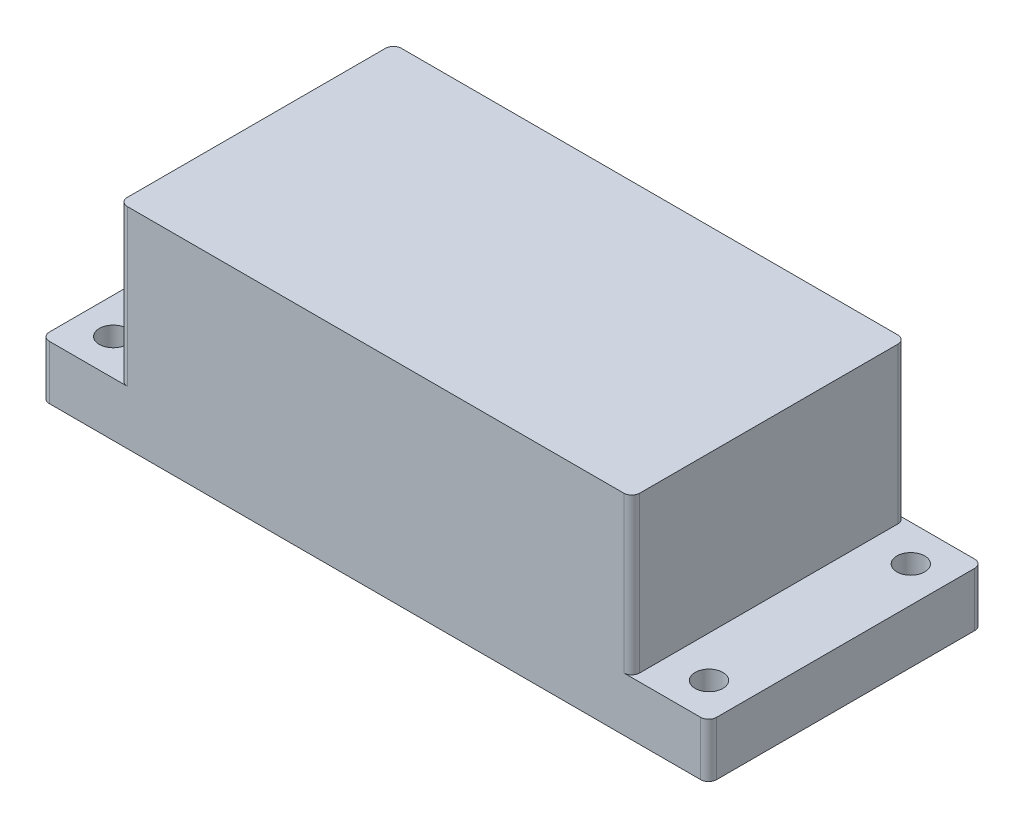
ISO-10303-21;
HEADER;
FILE_DESCRIPTION(('STEP AP214'),'2;1');
FILE_NAME('part.step','',(''),(''),'','','');
FILE_SCHEMA(('AUTOMOTIVE_DESIGN { 1 0 10303 214 1 1 1 1 }'));
ENDSEC;
DATA;
#1=APPLICATION_CONTEXT('core data for automotive mechanical design processes');
#2=APPLICATION_PROTOCOL_DEFINITION('international standard','automotive_design',2000,#1);
#3=PRODUCT_CONTEXT('',#1,'mechanical');
#4=PRODUCT('Part','Part','',(#3));
#5=PRODUCT_RELATED_PRODUCT_CATEGORY('part','',(#4));
#6=PRODUCT_DEFINITION_FORMATION('','',#4);
#7=PRODUCT_DEFINITION_CONTEXT('part definition',#1,'design');
#8=PRODUCT_DEFINITION('design','',#6,#7);
#9=PRODUCT_DEFINITION_SHAPE('','',#8);
#10=(LENGTH_UNIT() NAMED_UNIT(*) SI_UNIT(.MILLI.,.METRE.));
#11=(NAMED_UNIT(*) PLANE_ANGLE_UNIT() SI_UNIT($,.RADIAN.));
#12=(NAMED_UNIT(*) SI_UNIT($,.STERADIAN.) SOLID_ANGLE_UNIT());
#13=UNCERTAINTY_MEASURE_WITH_UNIT(LENGTH_MEASURE(1.E-05),#10,'distance_accuracy_value','');
#14=(GEOMETRIC_REPRESENTATION_CONTEXT(3) GLOBAL_UNCERTAINTY_ASSIGNED_CONTEXT((#13)) GLOBAL_UNIT_ASSIGNED_CONTEXT((#10,
#11,#12)) REPRESENTATION_CONTEXT('',''));
#15=CARTESIAN_POINT('',(0.,0.,0.));
#16=DIRECTION('',(0.,0.,1.));
#17=DIRECTION('',(1.,0.,0.));
#18=AXIS2_PLACEMENT_3D('',#15,#16,#17);
#19=CARTESIAN_POINT('',(0.,6.8,0.));
#20=DIRECTION('',(0.,1.,0.));
#21=DIRECTION('',(0.,0.,1.));
#22=AXIS2_PLACEMENT_3D('',#19,#20,#21);
#23=PLANE('',#22);
#24=CARTESIAN_POINT('',(-11.751256281407,6.8,-4.20125628140704));
#25=DIRECTION('',(0.,1.,0.));
#26=DIRECTION('',(0.,0.,1.));
#27=AXIS2_PLACEMENT_3D('',#24,#25,#26);
#28=CIRCLE('',#27,1.75);
#29=CARTESIAN_POINT('',(-11.751256281407,6.8,-2.45125628140704));
#30=VERTEX_POINT('',#29);
#31=EDGE_CURVE('E537',#30,#30,#28,.T.);
#32=ORIENTED_EDGE('',*,*,#31,.F.);
#33=EDGE_LOOP('',(#32));
#34=FACE_BOUND('',#33,.T.);
#35=CARTESIAN_POINT('',(-11.751256281407,6.8,21.198743718593));
#36=DIRECTION('',(0.,1.,0.));
#37=DIRECTION('',(0.,0.,1.));
#38=AXIS2_PLACEMENT_3D('',#35,#36,#37);
#39=CIRCLE('',#38,1.75);
#40=CARTESIAN_POINT('',(-11.751256281407,6.8,22.948743718593));
#41=VERTEX_POINT('',#40);
#42=EDGE_CURVE('E533',#41,#41,#39,.T.);
#43=ORIENTED_EDGE('',*,*,#42,.F.);
#44=EDGE_LOOP('',(#43));
#45=FACE_BOUND('',#44,.T.);
#46=DIRECTION('',(-1.,0.,0.));
#47=VECTOR('',#46,1.);
#48=CARTESIAN_POINT('',(-16.251256281407,6.8,-8.75125628140704));
#49=LINE('',#48,#47);
#50=CARTESIAN_POINT('',(-5.42534079512154,6.8,-8.75125628140704));
#51=VERTEX_POINT('',#50);
#52=CARTESIAN_POINT('',(-15.251256281407,6.8,-8.75125628140704));
#53=VERTEX_POINT('',#52);
#54=EDGE_CURVE('E240',#51,#53,#49,.T.);
#55=ORIENTED_EDGE('',*,*,#54,.T.);
#56=CARTESIAN_POINT('',(-15.251256281407,6.8,-7.75125628140704));
#57=DIRECTION('',(0.,1.,0.));
#58=DIRECTION('',(0.,0.,1.));
#59=AXIS2_PLACEMENT_3D('',#56,#57,#58);
#60=CIRCLE('',#59,1.);
#61=CARTESIAN_POINT('',(-16.251256281407,6.8,-7.75125628140704));
#62=VERTEX_POINT('',#61);
#63=EDGE_CURVE('E207',#53,#62,#60,.T.);
#64=ORIENTED_EDGE('',*,*,#63,.T.);
#65=DIRECTION('',(0.,0.,1.));
#66=VECTOR('',#65,1.);
#67=CARTESIAN_POINT('',(-16.251256281407,6.8,-8.75125628140704));
#68=LINE('',#67,#66);
#69=CARTESIAN_POINT('',(-16.251256281407,6.8,24.748743718593));
#70=VERTEX_POINT('',#69);
#71=EDGE_CURVE('E174',#62,#70,#68,.T.);
#72=ORIENTED_EDGE('',*,*,#71,.T.);
#73=CARTESIAN_POINT('',(-15.251256281407,6.8,24.748743718593));
#74=DIRECTION('',(0.,1.,0.));
#75=DIRECTION('',(0.,0.,1.));
#76=AXIS2_PLACEMENT_3D('',#73,#74,#75);
#77=CIRCLE('',#76,1.);
#78=CARTESIAN_POINT('',(-15.251256281407,6.8,25.748743718593));
#79=VERTEX_POINT('',#78);
#80=EDGE_CURVE('E205',#70,#79,#77,.T.);
#81=ORIENTED_EDGE('',*,*,#80,.T.);
#82=DIRECTION('',(1.,0.,0.));
#83=VECTOR('',#82,1.);
#84=CARTESIAN_POINT('',(-16.251256281407,6.8,25.748743718593));
#85=LINE('',#84,#83);
#86=CARTESIAN_POINT('',(-5.42534079512154,6.8,25.748743718593));
#87=VERTEX_POINT('',#86);
#88=EDGE_CURVE('E270',#79,#87,#85,.T.);
#89=ORIENTED_EDGE('',*,*,#88,.T.);
#90=CARTESIAN_POINT('',(-5.42534079512154,6.8,24.748743718593));
#91=DIRECTION('',(0.,1.,0.));
#92=DIRECTION('',(0.,0.,1.));
#93=AXIS2_PLACEMENT_3D('',#90,#91,#92);
#94=CIRCLE('',#93,1.);
#95=CARTESIAN_POINT('',(-6.42534079512154,6.8,24.748743718593));
#96=VERTEX_POINT('',#95);
#97=EDGE_CURVE('E11',#87,#96,#94,.F.);
#98=ORIENTED_EDGE('',*,*,#97,.T.);
#99=DIRECTION('',(0.,0.,1.));
#100=VECTOR('',#99,1.);
#101=CARTESIAN_POINT('',(-6.42534079512154,6.8,-8.75125628140704));
#102=LINE('',#101,#100);
#103=CARTESIAN_POINT('',(-6.42534079512154,6.8,-7.75125628140704));
#104=VERTEX_POINT('',#103);
#105=EDGE_CURVE('E242',#104,#96,#102,.T.);
#106=ORIENTED_EDGE('',*,*,#105,.F.);
#107=CARTESIAN_POINT('',(-5.42534079512154,6.8,-7.75125628140704));
#108=DIRECTION('',(0.,1.,0.));
#109=DIRECTION('',(0.,0.,1.));
#110=AXIS2_PLACEMENT_3D('',#107,#108,#109);
#111=CIRCLE('',#110,1.);
#112=EDGE_CURVE('E41',#104,#51,#111,.F.);
#113=ORIENTED_EDGE('',*,*,#112,.T.);
#114=EDGE_LOOP('',(#55,#64,#72,#81,#89,#98,#106,#113));
#115=FACE_BOUND('',#114,.T.);
#116=ADVANCED_FACE('F33',(#34,#45,#115),#23,.T.);
#117=CARTESIAN_POINT('',(-16.251256281407,6.8,-8.75125628140704));
#118=DIRECTION('',(1.,0.,0.));
#119=DIRECTION('',(0.,0.,-1.));
#120=AXIS2_PLACEMENT_3D('',#117,#118,#119);
#121=PLANE('',#120);
#122=ORIENTED_EDGE('',*,*,#71,.F.);
#123=DIRECTION('',(0.,-1.,0.));
#124=VECTOR('',#123,1.);
#125=CARTESIAN_POINT('',(-16.251256281407,6.8,-7.75125628140704));
#126=LINE('',#125,#124);
#127=CARTESIAN_POINT('',(-16.251256281407,0.,-7.75125628140704));
#128=VERTEX_POINT('',#127);
#129=EDGE_CURVE('E202',#62,#128,#126,.T.);
#130=ORIENTED_EDGE('',*,*,#129,.T.);
#131=DIRECTION('',(0.,0.,1.));
#132=VECTOR('',#131,1.);
#133=CARTESIAN_POINT('',(-16.251256281407,0.,-8.75125628140704));
#134=LINE('',#133,#132);
#135=CARTESIAN_POINT('',(-16.251256281407,0.,24.748743718593));
#136=VERTEX_POINT('',#135);
#137=EDGE_CURVE('E255',#128,#136,#134,.T.);
#138=ORIENTED_EDGE('',*,*,#137,.T.);
#139=DIRECTION('',(0.,-1.,0.));
#140=VECTOR('',#139,1.);
#141=CARTESIAN_POINT('',(-16.251256281407,6.8,24.748743718593));
#142=LINE('',#141,#140);
#143=EDGE_CURVE('E200',#136,#70,#142,.F.);
#144=ORIENTED_EDGE('',*,*,#143,.T.);
#145=EDGE_LOOP('',(#122,#130,#138,#144));
#146=FACE_BOUND('',#145,.T.);
#147=ADVANCED_FACE('F299',(#146),#121,.F.);
#148=CARTESIAN_POINT('',(-16.251256281407,6.8,25.748743718593));
#149=DIRECTION('',(0.,0.,-1.));
#150=DIRECTION('',(-1.,0.,0.));
#151=AXIS2_PLACEMENT_3D('',#148,#149,#150);
#152=PLANE('',#151);
#153=CARTESIAN_POINT('',(57.0746592048785,6.8,25.748743718593));
#154=VERTEX_POINT('',#153);
#155=CARTESIAN_POINT('',(66.7487437185929,6.8,25.748743718593));
#156=VERTEX_POINT('',#155);
#157=EDGE_CURVE('E178',#154,#156,#85,.T.);
#158=ORIENTED_EDGE('',*,*,#157,.F.);
#159=DIRECTION('',(0.,-1.,0.));
#160=VECTOR('',#159,1.);
#161=CARTESIAN_POINT('',(57.0746592048785,6.8,25.748743718593));
#162=LINE('',#161,#160);
#163=CARTESIAN_POINT('',(57.0746592048785,26.4,25.748743718593));
#164=VERTEX_POINT('',#163);
#165=EDGE_CURVE('E217',#154,#164,#162,.F.);
#166=ORIENTED_EDGE('',*,*,#165,.T.);
#167=DIRECTION('',(1.,0.,0.));
#168=VECTOR('',#167,1.);
#169=CARTESIAN_POINT('',(-6.42534079512154,26.4,25.748743718593));
#170=LINE('',#169,#168);
#171=CARTESIAN_POINT('',(-5.42534079512154,26.4,25.748743718593));
#172=VERTEX_POINT('',#171);
#173=EDGE_CURVE('E260',#172,#164,#170,.T.);
#174=ORIENTED_EDGE('',*,*,#173,.F.);
#175=DIRECTION('',(0.,-1.,0.));
#176=VECTOR('',#175,1.);
#177=CARTESIAN_POINT('',(-5.42534079512154,6.8,25.748743718593));
#178=LINE('',#177,#176);
#179=EDGE_CURVE('E214',#172,#87,#178,.T.);
#180=ORIENTED_EDGE('',*,*,#179,.T.);
#181=ORIENTED_EDGE('',*,*,#88,.F.);
#182=DIRECTION('',(0.,-1.,0.));
#183=VECTOR('',#182,1.);
#184=CARTESIAN_POINT('',(-15.251256281407,6.8,25.748743718593));
#185=LINE('',#184,#183);
#186=CARTESIAN_POINT('',(-15.251256281407,0.,25.748743718593));
#187=VERTEX_POINT('',#186);
#188=EDGE_CURVE('E195',#79,#187,#185,.T.);
#189=ORIENTED_EDGE('',*,*,#188,.T.);
#190=DIRECTION('',(1.,0.,0.));
#191=VECTOR('',#190,1.);
#192=CARTESIAN_POINT('',(-16.251256281407,0.,25.748743718593));
#193=LINE('',#192,#191);
#194=CARTESIAN_POINT('',(66.7487437185929,0.,25.748743718593));
#195=VERTEX_POINT('',#194);
#196=EDGE_CURVE('E180',#187,#195,#193,.T.);
#197=ORIENTED_EDGE('',*,*,#196,.T.);
#198=DIRECTION('',(0.,-1.,0.));
#199=VECTOR('',#198,1.);
#200=CARTESIAN_POINT('',(66.748743718593,6.8,25.748743718593));
#201=LINE('',#200,#199);
#202=EDGE_CURVE('E198',#195,#156,#201,.F.);
#203=ORIENTED_EDGE('',*,*,#202,.T.);
#204=EDGE_LOOP('',(#158,#166,#174,#180,#181,#189,#197,#203));
#205=FACE_BOUND('',#204,.T.);
#206=ADVANCED_FACE('F279',(#205),#152,.F.);
#207=CARTESIAN_POINT('',(67.748743718593,6.8,-8.75125628140704));
#208=DIRECTION('',(-1.,0.,0.));
#209=DIRECTION('',(0.,0.,1.));
#210=AXIS2_PLACEMENT_3D('',#207,#208,#209);
#211=PLANE('',#210);
#212=DIRECTION('',(0.,0.,-1.));
#213=VECTOR('',#212,1.);
#214=CARTESIAN_POINT('',(67.748743718593,0.,-8.75125628140704));
#215=LINE('',#214,#213);
#216=CARTESIAN_POINT('',(67.748743718593,0.,24.748743718593));
#217=VERTEX_POINT('',#216);
#218=CARTESIAN_POINT('',(67.748743718593,0.,-7.75125628140704));
#219=VERTEX_POINT('',#218);
#220=EDGE_CURVE('E175',#217,#219,#215,.T.);
#221=ORIENTED_EDGE('',*,*,#220,.T.);
#222=DIRECTION('',(0.,-1.,0.));
#223=VECTOR('',#222,1.);
#224=CARTESIAN_POINT('',(67.748743718593,6.8,-7.75125628140704));
#225=LINE('',#224,#223);
#226=CARTESIAN_POINT('',(67.748743718593,6.8,-7.75125628140704));
#227=VERTEX_POINT('',#226);
#228=EDGE_CURVE('E151',#219,#227,#225,.F.);
#229=ORIENTED_EDGE('',*,*,#228,.T.);
#230=DIRECTION('',(0.,0.,-1.));
#231=VECTOR('',#230,1.);
#232=CARTESIAN_POINT('',(67.748743718593,6.8,-8.75125628140704));
#233=LINE('',#232,#231);
#234=CARTESIAN_POINT('',(67.748743718593,6.8,24.748743718593));
#235=VERTEX_POINT('',#234);
#236=EDGE_CURVE('E272',#235,#227,#233,.T.);
#237=ORIENTED_EDGE('',*,*,#236,.F.);
#238=DIRECTION('',(0.,-1.,0.));
#239=VECTOR('',#238,1.);
#240=CARTESIAN_POINT('',(67.748743718593,6.8,24.748743718593));
#241=LINE('',#240,#239);
#242=EDGE_CURVE('E156',#235,#217,#241,.T.);
#243=ORIENTED_EDGE('',*,*,#242,.T.);
#244=EDGE_LOOP('',(#221,#229,#237,#243));
#245=FACE_BOUND('',#244,.T.);
#246=ADVANCED_FACE('F291',(#245),#211,.F.);
#247=CARTESIAN_POINT('',(-16.251256281407,6.8,-8.75125628140704));
#248=DIRECTION('',(0.,0.,1.));
#249=DIRECTION('',(1.,0.,0.));
#250=AXIS2_PLACEMENT_3D('',#247,#248,#249);
#251=PLANE('',#250);
#252=DIRECTION('',(-1.,0.,0.));
#253=VECTOR('',#252,1.);
#254=CARTESIAN_POINT('',(-6.42534079512154,26.4,-8.75125628140704));
#255=LINE('',#254,#253);
#256=CARTESIAN_POINT('',(57.0746592048785,26.4,-8.75125628140704));
#257=VERTEX_POINT('',#256);
#258=CARTESIAN_POINT('',(-5.42534079512154,26.4,-8.75125628140704));
#259=VERTEX_POINT('',#258);
#260=EDGE_CURVE('E246',#257,#259,#255,.T.);
#261=ORIENTED_EDGE('',*,*,#260,.F.);
#262=DIRECTION('',(0.,-1.,0.));
#263=VECTOR('',#262,1.);
#264=CARTESIAN_POINT('',(57.0746592048785,6.8,-8.75125628140704));
#265=LINE('',#264,#263);
#266=CARTESIAN_POINT('',(57.0746592048784,6.8,-8.75125628140704));
#267=VERTEX_POINT('',#266);
#268=EDGE_CURVE('E229',#257,#267,#265,.T.);
#269=ORIENTED_EDGE('',*,*,#268,.T.);
#270=CARTESIAN_POINT('',(66.7487437185929,6.8,-8.75125628140704));
#271=VERTEX_POINT('',#270);
#272=EDGE_CURVE('E167',#271,#267,#49,.T.);
#273=ORIENTED_EDGE('',*,*,#272,.F.);
#274=DIRECTION('',(0.,-1.,0.));
#275=VECTOR('',#274,1.);
#276=CARTESIAN_POINT('',(66.748743718593,6.8,-8.75125628140704));
#277=LINE('',#276,#275);
#278=CARTESIAN_POINT('',(66.7487437185929,0.,-8.75125628140704));
#279=VERTEX_POINT('',#278);
#280=EDGE_CURVE('E150',#271,#279,#277,.T.);
#281=ORIENTED_EDGE('',*,*,#280,.T.);
#282=DIRECTION('',(-1.,0.,0.));
#283=VECTOR('',#282,1.);
#284=CARTESIAN_POINT('',(-16.251256281407,0.,-8.75125628140704));
#285=LINE('',#284,#283);
#286=CARTESIAN_POINT('',(-15.251256281407,0.,-8.75125628140704));
#287=VERTEX_POINT('',#286);
#288=EDGE_CURVE('E164',#279,#287,#285,.T.);
#289=ORIENTED_EDGE('',*,*,#288,.T.);
#290=DIRECTION('',(0.,-1.,0.));
#291=VECTOR('',#290,1.);
#292=CARTESIAN_POINT('',(-15.251256281407,6.8,-8.75125628140704));
#293=LINE('',#292,#291);
#294=EDGE_CURVE('E169',#287,#53,#293,.F.);
#295=ORIENTED_EDGE('',*,*,#294,.T.);
#296=ORIENTED_EDGE('',*,*,#54,.F.);
#297=DIRECTION('',(0.,-1.,0.));
#298=VECTOR('',#297,1.);
#299=CARTESIAN_POINT('',(-5.42534079512154,6.8,-8.75125628140704));
#300=LINE('',#299,#298);
#301=EDGE_CURVE('E227',#51,#259,#300,.F.);
#302=ORIENTED_EDGE('',*,*,#301,.T.);
#303=EDGE_LOOP('',(#261,#269,#273,#281,#289,#295,#296,#302));
#304=FACE_BOUND('',#303,.T.);
#305=ADVANCED_FACE('F163',(#304),#251,.F.);
#306=CARTESIAN_POINT('',(63.248743718593,6.8,21.198743718593));
#307=DIRECTION('',(0.,1.,0.));
#308=DIRECTION('',(0.,0.,1.));
#309=AXIS2_PLACEMENT_3D('',#306,#307,#308);
#310=CIRCLE('',#309,1.75);
#311=CARTESIAN_POINT('',(63.248743718593,6.8,22.948743718593));
#312=VERTEX_POINT('',#311);
#313=EDGE_CURVE('E323',#312,#312,#310,.T.);
#314=ORIENTED_EDGE('',*,*,#313,.F.);
#315=EDGE_LOOP('',(#314));
#316=FACE_BOUND('',#315,.T.);
#317=CARTESIAN_POINT('',(63.248743718593,6.8,-4.20125628140704));
#318=DIRECTION('',(0.,1.,0.));
#319=DIRECTION('',(0.,0.,1.));
#320=AXIS2_PLACEMENT_3D('',#317,#318,#319);
#321=CIRCLE('',#320,1.75);
#322=CARTESIAN_POINT('',(63.248743718593,6.8,-2.45125628140704));
#323=VERTEX_POINT('',#322);
#324=EDGE_CURVE('E326',#323,#323,#321,.T.);
#325=ORIENTED_EDGE('',*,*,#324,.F.);
#326=EDGE_LOOP('',(#325));
#327=FACE_BOUND('',#326,.T.);
#328=ORIENTED_EDGE('',*,*,#236,.T.);
#329=CARTESIAN_POINT('',(66.748743718593,6.8,-7.75125628140704));
#330=DIRECTION('',(0.,1.,0.));
#331=DIRECTION('',(0.,0.,1.));
#332=AXIS2_PLACEMENT_3D('',#329,#330,#331);
#333=CIRCLE('',#332,1.);
#334=EDGE_CURVE('E193',#227,#271,#333,.T.);
#335=ORIENTED_EDGE('',*,*,#334,.T.);
#336=ORIENTED_EDGE('',*,*,#272,.T.);
#337=CARTESIAN_POINT('',(57.0746592048785,6.8,-7.75125628140704));
#338=DIRECTION('',(0.,1.,0.));
#339=DIRECTION('',(0.,0.,1.));
#340=AXIS2_PLACEMENT_3D('',#337,#338,#339);
#341=CIRCLE('',#340,1.);
#342=CARTESIAN_POINT('',(58.0746592048785,6.8,-7.75125628140704));
#343=VERTEX_POINT('',#342);
#344=EDGE_CURVE('E238',#267,#343,#341,.F.);
#345=ORIENTED_EDGE('',*,*,#344,.T.);
#346=DIRECTION('',(0.,0.,-1.));
#347=VECTOR('',#346,1.);
#348=CARTESIAN_POINT('',(58.0746592048785,6.8,-8.75125628140704));
#349=LINE('',#348,#347);
#350=CARTESIAN_POINT('',(58.0746592048785,6.8,24.748743718593));
#351=VERTEX_POINT('',#350);
#352=EDGE_CURVE('E265',#351,#343,#349,.T.);
#353=ORIENTED_EDGE('',*,*,#352,.F.);
#354=CARTESIAN_POINT('',(57.0746592048785,6.8,24.748743718593));
#355=DIRECTION('',(0.,1.,0.));
#356=DIRECTION('',(0.,0.,1.));
#357=AXIS2_PLACEMENT_3D('',#354,#355,#356);
#358=CIRCLE('',#357,1.);
#359=EDGE_CURVE('E235',#351,#154,#358,.F.);
#360=ORIENTED_EDGE('',*,*,#359,.T.);
#361=ORIENTED_EDGE('',*,*,#157,.T.);
#362=CARTESIAN_POINT('',(66.748743718593,6.8,24.748743718593));
#363=DIRECTION('',(0.,1.,0.));
#364=DIRECTION('',(0.,0.,1.));
#365=AXIS2_PLACEMENT_3D('',#362,#363,#364);
#366=CIRCLE('',#365,1.);
#367=EDGE_CURVE('E191',#156,#235,#366,.T.);
#368=ORIENTED_EDGE('',*,*,#367,.T.);
#369=EDGE_LOOP('',(#328,#335,#336,#345,#353,#360,#361,#368));
#370=FACE_BOUND('',#369,.T.);
#371=ADVANCED_FACE('F289',(#316,#327,#370),#23,.T.);
#372=CARTESIAN_POINT('',(0.,0.,0.));
#373=DIRECTION('',(0.,1.,0.));
#374=DIRECTION('',(0.,0.,1.));
#375=AXIS2_PLACEMENT_3D('',#372,#373,#374);
#376=PLANE('',#375);
#377=CARTESIAN_POINT('',(-11.751256281407,0.,-4.20125628140704));
#378=DIRECTION('',(0.,1.,0.));
#379=DIRECTION('',(0.,0.,1.));
#380=AXIS2_PLACEMENT_3D('',#377,#378,#379);
#381=CIRCLE('',#380,1.75);
#382=CARTESIAN_POINT('',(-11.751256281407,0.,-2.45125628140704));
#383=VERTEX_POINT('',#382);
#384=EDGE_CURVE('E335',#383,#383,#381,.F.);
#385=ORIENTED_EDGE('',*,*,#384,.F.);
#386=EDGE_LOOP('',(#385));
#387=FACE_BOUND('',#386,.T.);
#388=CARTESIAN_POINT('',(-11.751256281407,0.,21.198743718593));
#389=DIRECTION('',(0.,1.,0.));
#390=DIRECTION('',(0.,0.,1.));
#391=AXIS2_PLACEMENT_3D('',#388,#389,#390);
#392=CIRCLE('',#391,1.75);
#393=CARTESIAN_POINT('',(-11.751256281407,0.,22.948743718593));
#394=VERTEX_POINT('',#393);
#395=EDGE_CURVE('E530',#394,#394,#392,.F.);
#396=ORIENTED_EDGE('',*,*,#395,.F.);
#397=EDGE_LOOP('',(#396));
#398=FACE_BOUND('',#397,.T.);
#399=CARTESIAN_POINT('',(63.248743718593,0.,21.198743718593));
#400=DIRECTION('',(0.,1.,0.));
#401=DIRECTION('',(0.,0.,1.));
#402=AXIS2_PLACEMENT_3D('',#399,#400,#401);
#403=CIRCLE('',#402,1.75);
#404=CARTESIAN_POINT('',(63.248743718593,0.,22.948743718593));
#405=VERTEX_POINT('',#404);
#406=EDGE_CURVE('E328',#405,#405,#403,.F.);
#407=ORIENTED_EDGE('',*,*,#406,.F.);
#408=EDGE_LOOP('',(#407));
#409=FACE_BOUND('',#408,.T.);
#410=CARTESIAN_POINT('',(63.248743718593,0.,-4.20125628140704));
#411=DIRECTION('',(0.,1.,0.));
#412=DIRECTION('',(0.,0.,1.));
#413=AXIS2_PLACEMENT_3D('',#410,#411,#412);
#414=CIRCLE('',#413,1.75);
#415=CARTESIAN_POINT('',(63.248743718593,0.,-2.45125628140704));
#416=VERTEX_POINT('',#415);
#417=EDGE_CURVE('E266',#416,#416,#414,.F.);
#418=ORIENTED_EDGE('',*,*,#417,.F.);
#419=EDGE_LOOP('',(#418));
#420=FACE_BOUND('',#419,.T.);
#421=ORIENTED_EDGE('',*,*,#288,.F.);
#422=CARTESIAN_POINT('',(66.748743718593,0.,-7.75125628140704));
#423=DIRECTION('',(0.,1.,0.));
#424=DIRECTION('',(0.,0.,1.));
#425=AXIS2_PLACEMENT_3D('',#422,#423,#424);
#426=CIRCLE('',#425,1.);
#427=EDGE_CURVE('E146',#279,#219,#426,.F.);
#428=ORIENTED_EDGE('',*,*,#427,.T.);
#429=ORIENTED_EDGE('',*,*,#220,.F.);
#430=CARTESIAN_POINT('',(66.748743718593,0.,24.748743718593));
#431=DIRECTION('',(0.,1.,0.));
#432=DIRECTION('',(0.,0.,1.));
#433=AXIS2_PLACEMENT_3D('',#430,#431,#432);
#434=CIRCLE('',#433,1.);
#435=EDGE_CURVE('E157',#217,#195,#434,.F.);
#436=ORIENTED_EDGE('',*,*,#435,.T.);
#437=ORIENTED_EDGE('',*,*,#196,.F.);
#438=CARTESIAN_POINT('',(-15.251256281407,0.,24.748743718593));
#439=DIRECTION('',(0.,1.,0.));
#440=DIRECTION('',(0.,0.,1.));
#441=AXIS2_PLACEMENT_3D('',#438,#439,#440);
#442=CIRCLE('',#441,1.);
#443=EDGE_CURVE('E168',#187,#136,#442,.F.);
#444=ORIENTED_EDGE('',*,*,#443,.T.);
#445=ORIENTED_EDGE('',*,*,#137,.F.);
#446=CARTESIAN_POINT('',(-15.251256281407,0.,-7.75125628140704));
#447=DIRECTION('',(0.,1.,0.));
#448=DIRECTION('',(0.,0.,1.));
#449=AXIS2_PLACEMENT_3D('',#446,#447,#448);
#450=CIRCLE('',#449,1.);
#451=EDGE_CURVE('E173',#128,#287,#450,.F.);
#452=ORIENTED_EDGE('',*,*,#451,.T.);
#453=EDGE_LOOP('',(#421,#428,#429,#436,#437,#444,#445,#452));
#454=FACE_BOUND('',#453,.T.);
#455=ADVANCED_FACE('F171',(#387,#398,#409,#420,#454),#376,.F.);
#456=CARTESIAN_POINT('',(-6.42534079512154,26.4,-8.75125628140704));
#457=DIRECTION('',(1.,0.,0.));
#458=DIRECTION('',(0.,0.,-1.));
#459=AXIS2_PLACEMENT_3D('',#456,#457,#458);
#460=PLANE('',#459);
#461=DIRECTION('',(0.,0.,1.));
#462=VECTOR('',#461,1.);
#463=CARTESIAN_POINT('',(-6.42534079512154,26.4,-8.75125628140704));
#464=LINE('',#463,#462);
#465=CARTESIAN_POINT('',(-6.42534079512154,26.4,-7.75125628140704));
#466=VERTEX_POINT('',#465);
#467=CARTESIAN_POINT('',(-6.42534079512154,26.4,24.748743718593));
#468=VERTEX_POINT('',#467);
#469=EDGE_CURVE('E268',#466,#468,#464,.T.);
#470=ORIENTED_EDGE('',*,*,#469,.F.);
#471=DIRECTION('',(0.,-1.,0.));
#472=VECTOR('',#471,1.);
#473=CARTESIAN_POINT('',(-6.42534079512154,26.4,-7.75125628140704));
#474=LINE('',#473,#472);
#475=EDGE_CURVE('E233',#466,#104,#474,.T.);
#476=ORIENTED_EDGE('',*,*,#475,.T.);
#477=ORIENTED_EDGE('',*,*,#105,.T.);
#478=DIRECTION('',(0.,-1.,0.));
#479=VECTOR('',#478,1.);
#480=CARTESIAN_POINT('',(-6.42534079512154,26.4,24.748743718593));
#481=LINE('',#480,#479);
#482=EDGE_CURVE('E231',#96,#468,#481,.F.);
#483=ORIENTED_EDGE('',*,*,#482,.T.);
#484=EDGE_LOOP('',(#470,#476,#477,#483));
#485=FACE_BOUND('',#484,.T.);
#486=ADVANCED_FACE('F318',(#485),#460,.F.);
#487=CARTESIAN_POINT('',(58.0746592048785,26.4,-8.75125628140704));
#488=DIRECTION('',(-1.,0.,0.));
#489=DIRECTION('',(0.,0.,1.));
#490=AXIS2_PLACEMENT_3D('',#487,#488,#489);
#491=PLANE('',#490);
#492=DIRECTION('',(0.,0.,-1.));
#493=VECTOR('',#492,1.);
#494=CARTESIAN_POINT('',(58.0746592048785,26.4,-8.75125628140704));
#495=LINE('',#494,#493);
#496=CARTESIAN_POINT('',(58.0746592048785,26.4,24.748743718593));
#497=VERTEX_POINT('',#496);
#498=CARTESIAN_POINT('',(58.0746592048785,26.4,-7.75125628140704));
#499=VERTEX_POINT('',#498);
#500=EDGE_CURVE('E256',#497,#499,#495,.T.);
#501=ORIENTED_EDGE('',*,*,#500,.F.);
#502=DIRECTION('',(0.,-1.,0.));
#503=VECTOR('',#502,1.);
#504=CARTESIAN_POINT('',(58.0746592048785,26.4,24.748743718593));
#505=LINE('',#504,#503);
#506=EDGE_CURVE('E211',#497,#351,#505,.T.);
#507=ORIENTED_EDGE('',*,*,#506,.T.);
#508=ORIENTED_EDGE('',*,*,#352,.T.);
#509=DIRECTION('',(0.,-1.,0.));
#510=VECTOR('',#509,1.);
#511=CARTESIAN_POINT('',(58.0746592048785,26.4,-7.75125628140704));
#512=LINE('',#511,#510);
#513=EDGE_CURVE('E209',#343,#499,#512,.F.);
#514=ORIENTED_EDGE('',*,*,#513,.T.);
#515=EDGE_LOOP('',(#501,#507,#508,#514));
#516=FACE_BOUND('',#515,.T.);
#517=ADVANCED_FACE('F349',(#516),#491,.F.);
#518=CARTESIAN_POINT('',(0.,26.4,0.));
#519=DIRECTION('',(0.,1.,0.));
#520=DIRECTION('',(0.,0.,1.));
#521=AXIS2_PLACEMENT_3D('',#518,#519,#520);
#522=PLANE('',#521);
#523=ORIENTED_EDGE('',*,*,#173,.T.);
#524=CARTESIAN_POINT('',(57.0746592048785,26.4,24.748743718593));
#525=DIRECTION('',(0.,1.,0.));
#526=DIRECTION('',(0.,0.,1.));
#527=AXIS2_PLACEMENT_3D('',#524,#525,#526);
#528=CIRCLE('',#527,1.);
#529=EDGE_CURVE('E225',#164,#497,#528,.T.);
#530=ORIENTED_EDGE('',*,*,#529,.T.);
#531=ORIENTED_EDGE('',*,*,#500,.T.);
#532=CARTESIAN_POINT('',(57.0746592048785,26.4,-7.75125628140704));
#533=DIRECTION('',(0.,1.,0.));
#534=DIRECTION('',(0.,0.,1.));
#535=AXIS2_PLACEMENT_3D('',#532,#533,#534);
#536=CIRCLE('',#535,1.);
#537=EDGE_CURVE('E223',#499,#257,#536,.T.);
#538=ORIENTED_EDGE('',*,*,#537,.T.);
#539=ORIENTED_EDGE('',*,*,#260,.T.);
#540=CARTESIAN_POINT('',(-5.42534079512154,26.4,-7.75125628140704));
#541=DIRECTION('',(0.,1.,0.));
#542=DIRECTION('',(0.,0.,1.));
#543=AXIS2_PLACEMENT_3D('',#540,#541,#542);
#544=CIRCLE('',#543,1.);
#545=EDGE_CURVE('E221',#259,#466,#544,.T.);
#546=ORIENTED_EDGE('',*,*,#545,.T.);
#547=ORIENTED_EDGE('',*,*,#469,.T.);
#548=CARTESIAN_POINT('',(-5.42534079512154,26.4,24.748743718593));
#549=DIRECTION('',(0.,1.,0.));
#550=DIRECTION('',(0.,0.,1.));
#551=AXIS2_PLACEMENT_3D('',#548,#549,#550);
#552=CIRCLE('',#551,1.);
#553=EDGE_CURVE('E219',#468,#172,#552,.T.);
#554=ORIENTED_EDGE('',*,*,#553,.T.);
#555=EDGE_LOOP('',(#523,#530,#531,#538,#539,#546,#547,#554));
#556=FACE_BOUND('',#555,.T.);
#557=ADVANCED_FACE('F250',(#556),#522,.T.);
#558=CARTESIAN_POINT('',(63.248743718593,-4.94974746830583,-4.20125628140704));
#559=DIRECTION('',(0.,1.,0.));
#560=DIRECTION('',(0.,0.,1.));
#561=AXIS2_PLACEMENT_3D('',#558,#559,#560);
#562=CYLINDRICAL_SURFACE('',#561,1.75);
#563=ORIENTED_EDGE('',*,*,#417,.T.);
#564=EDGE_LOOP('',(#563));
#565=FACE_BOUND('',#564,.T.);
#566=ORIENTED_EDGE('',*,*,#324,.T.);
#567=EDGE_LOOP('',(#566));
#568=FACE_BOUND('',#567,.T.);
#569=ADVANCED_FACE('F390',(#565,#568),#562,.F.);
#570=CARTESIAN_POINT('',(63.248743718593,-4.94974746830583,21.198743718593));
#571=DIRECTION('',(0.,1.,0.));
#572=DIRECTION('',(0.,0.,1.));
#573=AXIS2_PLACEMENT_3D('',#570,#571,#572);
#574=CYLINDRICAL_SURFACE('',#573,1.75);
#575=ORIENTED_EDGE('',*,*,#406,.T.);
#576=EDGE_LOOP('',(#575));
#577=FACE_BOUND('',#576,.T.);
#578=ORIENTED_EDGE('',*,*,#313,.T.);
#579=EDGE_LOOP('',(#578));
#580=FACE_BOUND('',#579,.T.);
#581=ADVANCED_FACE('F383',(#577,#580),#574,.F.);
#582=CARTESIAN_POINT('',(-11.751256281407,-4.94974746830583,21.198743718593));
#583=DIRECTION('',(0.,1.,0.));
#584=DIRECTION('',(0.,0.,1.));
#585=AXIS2_PLACEMENT_3D('',#582,#583,#584);
#586=CYLINDRICAL_SURFACE('',#585,1.75);
#587=ORIENTED_EDGE('',*,*,#395,.T.);
#588=EDGE_LOOP('',(#587));
#589=FACE_BOUND('',#588,.T.);
#590=ORIENTED_EDGE('',*,*,#42,.T.);
#591=EDGE_LOOP('',(#590));
#592=FACE_BOUND('',#591,.T.);
#593=ADVANCED_FACE('F377',(#589,#592),#586,.F.);
#594=CARTESIAN_POINT('',(-11.751256281407,-4.94974746830583,-4.20125628140704));
#595=DIRECTION('',(0.,1.,0.));
#596=DIRECTION('',(0.,0.,1.));
#597=AXIS2_PLACEMENT_3D('',#594,#595,#596);
#598=CYLINDRICAL_SURFACE('',#597,1.75);
#599=ORIENTED_EDGE('',*,*,#384,.T.);
#600=EDGE_LOOP('',(#599));
#601=FACE_BOUND('',#600,.T.);
#602=ORIENTED_EDGE('',*,*,#31,.T.);
#603=EDGE_LOOP('',(#602));
#604=FACE_BOUND('',#603,.T.);
#605=ADVANCED_FACE('F373',(#601,#604),#598,.F.);
#606=CARTESIAN_POINT('',(66.748743718593,6.8,-7.75125628140704));
#607=DIRECTION('',(0.,-1.,0.));
#608=DIRECTION('',(0.,0.,-1.));
#609=AXIS2_PLACEMENT_3D('',#606,#607,#608);
#610=CYLINDRICAL_SURFACE('',#609,1.);
#611=ORIENTED_EDGE('',*,*,#334,.F.);
#612=ORIENTED_EDGE('',*,*,#228,.F.);
#613=ORIENTED_EDGE('',*,*,#427,.F.);
#614=ORIENTED_EDGE('',*,*,#280,.F.);
#615=EDGE_LOOP('',(#611,#612,#613,#614));
#616=FACE_BOUND('',#615,.T.);
#617=ADVANCED_FACE('F149',(#616),#610,.T.);
#618=CARTESIAN_POINT('',(66.748743718593,6.8,24.748743718593));
#619=DIRECTION('',(0.,-1.,0.));
#620=DIRECTION('',(0.,0.,-1.));
#621=AXIS2_PLACEMENT_3D('',#618,#619,#620);
#622=CYLINDRICAL_SURFACE('',#621,1.);
#623=ORIENTED_EDGE('',*,*,#367,.F.);
#624=ORIENTED_EDGE('',*,*,#202,.F.);
#625=ORIENTED_EDGE('',*,*,#435,.F.);
#626=ORIENTED_EDGE('',*,*,#242,.F.);
#627=EDGE_LOOP('',(#623,#624,#625,#626));
#628=FACE_BOUND('',#627,.T.);
#629=ADVANCED_FACE('F285',(#628),#622,.T.);
#630=CARTESIAN_POINT('',(-15.251256281407,6.8,-7.75125628140704));
#631=DIRECTION('',(0.,-1.,0.));
#632=DIRECTION('',(0.,0.,-1.));
#633=AXIS2_PLACEMENT_3D('',#630,#631,#632);
#634=CYLINDRICAL_SURFACE('',#633,1.);
#635=ORIENTED_EDGE('',*,*,#63,.F.);
#636=ORIENTED_EDGE('',*,*,#294,.F.);
#637=ORIENTED_EDGE('',*,*,#451,.F.);
#638=ORIENTED_EDGE('',*,*,#129,.F.);
#639=EDGE_LOOP('',(#635,#636,#637,#638));
#640=FACE_BOUND('',#639,.T.);
#641=ADVANCED_FACE('F365',(#640),#634,.T.);
#642=CARTESIAN_POINT('',(-15.251256281407,6.8,24.748743718593));
#643=DIRECTION('',(0.,-1.,0.));
#644=DIRECTION('',(0.,0.,-1.));
#645=AXIS2_PLACEMENT_3D('',#642,#643,#644);
#646=CYLINDRICAL_SURFACE('',#645,1.);
#647=ORIENTED_EDGE('',*,*,#80,.F.);
#648=ORIENTED_EDGE('',*,*,#143,.F.);
#649=ORIENTED_EDGE('',*,*,#443,.F.);
#650=ORIENTED_EDGE('',*,*,#188,.F.);
#651=EDGE_LOOP('',(#647,#648,#649,#650));
#652=FACE_BOUND('',#651,.T.);
#653=ADVANCED_FACE('F360',(#652),#646,.T.);
#654=CARTESIAN_POINT('',(57.0746592048785,26.4,24.748743718593));
#655=DIRECTION('',(0.,-1.,0.));
#656=DIRECTION('',(0.,0.,-1.));
#657=AXIS2_PLACEMENT_3D('',#654,#655,#656);
#658=CYLINDRICAL_SURFACE('',#657,1.);
#659=ORIENTED_EDGE('',*,*,#529,.F.);
#660=ORIENTED_EDGE('',*,*,#165,.F.);
#661=ORIENTED_EDGE('',*,*,#359,.F.);
#662=ORIENTED_EDGE('',*,*,#506,.F.);
#663=EDGE_LOOP('',(#659,#660,#661,#662));
#664=FACE_BOUND('',#663,.T.);
#665=ADVANCED_FACE('F346',(#664),#658,.T.);
#666=CARTESIAN_POINT('',(57.0746592048785,6.8,-7.75125628140704));
#667=DIRECTION('',(0.,-1.,0.));
#668=DIRECTION('',(0.,0.,-1.));
#669=AXIS2_PLACEMENT_3D('',#666,#667,#668);
#670=CYLINDRICAL_SURFACE('',#669,1.);
#671=ORIENTED_EDGE('',*,*,#537,.F.);
#672=ORIENTED_EDGE('',*,*,#513,.F.);
#673=ORIENTED_EDGE('',*,*,#344,.F.);
#674=ORIENTED_EDGE('',*,*,#268,.F.);
#675=EDGE_LOOP('',(#671,#672,#673,#674));
#676=FACE_BOUND('',#675,.T.);
#677=ADVANCED_FACE('F353',(#676),#670,.T.);
#678=CARTESIAN_POINT('',(-5.42534079512154,26.4,-7.75125628140704));
#679=DIRECTION('',(0.,-1.,0.));
#680=DIRECTION('',(0.,0.,-1.));
#681=AXIS2_PLACEMENT_3D('',#678,#679,#680);
#682=CYLINDRICAL_SURFACE('',#681,1.);
#683=ORIENTED_EDGE('',*,*,#545,.F.);
#684=ORIENTED_EDGE('',*,*,#301,.F.);
#685=ORIENTED_EDGE('',*,*,#112,.F.);
#686=ORIENTED_EDGE('',*,*,#475,.F.);
#687=EDGE_LOOP('',(#683,#684,#685,#686));
#688=FACE_BOUND('',#687,.T.);
#689=ADVANCED_FACE('F244',(#688),#682,.T.);
#690=CARTESIAN_POINT('',(-5.42534079512154,6.8,24.748743718593));
#691=DIRECTION('',(0.,-1.,0.));
#692=DIRECTION('',(0.,0.,-1.));
#693=AXIS2_PLACEMENT_3D('',#690,#691,#692);
#694=CYLINDRICAL_SURFACE('',#693,1.);
#695=ORIENTED_EDGE('',*,*,#553,.F.);
#696=ORIENTED_EDGE('',*,*,#482,.F.);
#697=ORIENTED_EDGE('',*,*,#97,.F.);
#698=ORIENTED_EDGE('',*,*,#179,.F.);
#699=EDGE_LOOP('',(#695,#696,#697,#698));
#700=FACE_BOUND('',#699,.T.);
#701=ADVANCED_FACE('F35',(#700),#694,.T.);
#702=CLOSED_SHELL('',(#116,#147,#206,#246,#305,#371,#455,#486,#517,#557,#569,#581,#593,#605,
#617,#629,#641,#653,#665,#677,#689,#701));
#703=MANIFOLD_SOLID_BREP('B2',#702);
#704=ADVANCED_BREP_SHAPE_REPRESENTATION('',(#18,#703),#14);
#705=SHAPE_DEFINITION_REPRESENTATION(#9,#704);
ENDSEC;
END-ISO-10303-21;
